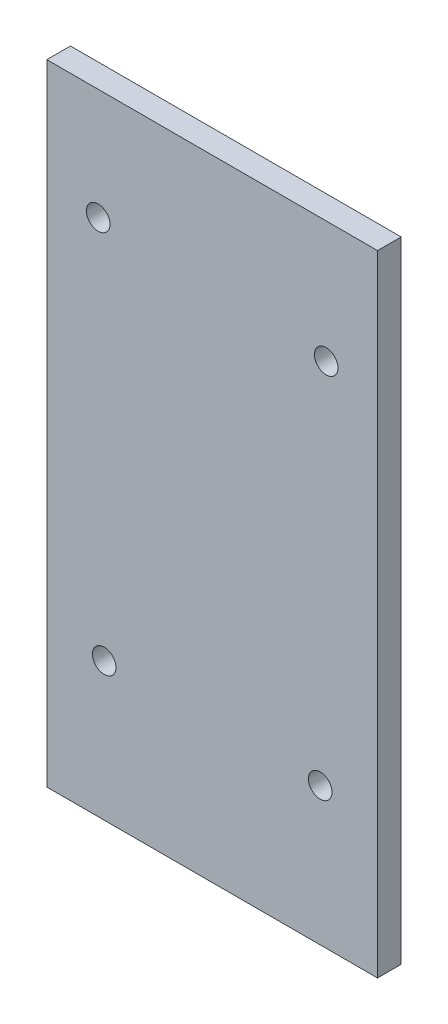
ISO-10303-21;
HEADER;
FILE_DESCRIPTION(('STEP AP214'),'2;1');
FILE_NAME('part.step','',(''),(''),'','','');
FILE_SCHEMA(('AUTOMOTIVE_DESIGN { 1 0 10303 214 1 1 1 1 }'));
ENDSEC;
DATA;
#1=APPLICATION_CONTEXT('core data for automotive mechanical design processes');
#2=APPLICATION_PROTOCOL_DEFINITION('international standard','automotive_design',2000,#1);
#3=PRODUCT_CONTEXT('',#1,'mechanical');
#4=PRODUCT('Part','Part','',(#3));
#5=PRODUCT_RELATED_PRODUCT_CATEGORY('part','',(#4));
#6=PRODUCT_DEFINITION_FORMATION('','',#4);
#7=PRODUCT_DEFINITION_CONTEXT('part definition',#1,'design');
#8=PRODUCT_DEFINITION('design','',#6,#7);
#9=PRODUCT_DEFINITION_SHAPE('','',#8);
#10=(LENGTH_UNIT() NAMED_UNIT(*) SI_UNIT(.MILLI.,.METRE.));
#11=(NAMED_UNIT(*) PLANE_ANGLE_UNIT() SI_UNIT($,.RADIAN.));
#12=(NAMED_UNIT(*) SI_UNIT($,.STERADIAN.) SOLID_ANGLE_UNIT());
#13=UNCERTAINTY_MEASURE_WITH_UNIT(LENGTH_MEASURE(1.E-05),#10,'distance_accuracy_value','');
#14=(GEOMETRIC_REPRESENTATION_CONTEXT(3) GLOBAL_UNCERTAINTY_ASSIGNED_CONTEXT((#13)) GLOBAL_UNIT_ASSIGNED_CONTEXT((#10,
#11,#12)) REPRESENTATION_CONTEXT('',''));
#15=CARTESIAN_POINT('',(0.,0.,0.));
#16=DIRECTION('',(0.,0.,1.));
#17=DIRECTION('',(1.,0.,0.));
#18=AXIS2_PLACEMENT_3D('',#15,#16,#17);
#19=CARTESIAN_POINT('',(-35.,66.67,5.));
#20=DIRECTION('',(1.,0.,0.));
#21=DIRECTION('',(0.,1.,0.));
#22=AXIS2_PLACEMENT_3D('',#19,#20,#21);
#23=PLANE('',#22);
#24=DIRECTION('',(0.,-1.,0.));
#25=VECTOR('',#24,1.);
#26=CARTESIAN_POINT('',(-35.,66.67,0.));
#27=LINE('',#26,#25);
#28=CARTESIAN_POINT('',(-35.,66.67,0.));
#29=VERTEX_POINT('',#28);
#30=CARTESIAN_POINT('',(-35.,-66.67,0.));
#31=VERTEX_POINT('',#30);
#32=EDGE_CURVE('E101',#29,#31,#27,.T.);
#33=ORIENTED_EDGE('',*,*,#32,.T.);
#34=DIRECTION('',(0.,0.,-1.));
#35=VECTOR('',#34,1.);
#36=CARTESIAN_POINT('',(-35.,-66.67,5.));
#37=LINE('',#36,#35);
#38=CARTESIAN_POINT('',(-35.,-66.67,5.));
#39=VERTEX_POINT('',#38);
#40=EDGE_CURVE('E11',#39,#31,#37,.T.);
#41=ORIENTED_EDGE('',*,*,#40,.F.);
#42=DIRECTION('',(0.,-1.,0.));
#43=VECTOR('',#42,1.);
#44=CARTESIAN_POINT('',(-35.,66.67,5.));
#45=LINE('',#44,#43);
#46=CARTESIAN_POINT('',(-35.,66.67,5.));
#47=VERTEX_POINT('',#46);
#48=EDGE_CURVE('E88',#47,#39,#45,.T.);
#49=ORIENTED_EDGE('',*,*,#48,.F.);
#50=DIRECTION('',(0.,0.,-1.));
#51=VECTOR('',#50,1.);
#52=CARTESIAN_POINT('',(-35.,66.67,5.));
#53=LINE('',#52,#51);
#54=EDGE_CURVE('E97',#47,#29,#53,.T.);
#55=ORIENTED_EDGE('',*,*,#54,.T.);
#56=EDGE_LOOP('',(#33,#41,#49,#55));
#57=FACE_BOUND('',#56,.T.);
#58=ADVANCED_FACE('F35',(#57),#23,.F.);
#59=CARTESIAN_POINT('',(35.,-66.67,5.));
#60=DIRECTION('',(0.,1.,0.));
#61=DIRECTION('',(-1.,0.,0.));
#62=AXIS2_PLACEMENT_3D('',#59,#60,#61);
#63=PLANE('',#62);
#64=DIRECTION('',(1.,0.,0.));
#65=VECTOR('',#64,1.);
#66=CARTESIAN_POINT('',(35.,-66.67,0.));
#67=LINE('',#66,#65);
#68=CARTESIAN_POINT('',(35.,-66.67,0.));
#69=VERTEX_POINT('',#68);
#70=EDGE_CURVE('E92',#31,#69,#67,.T.);
#71=ORIENTED_EDGE('',*,*,#70,.T.);
#72=DIRECTION('',(0.,0.,-1.));
#73=VECTOR('',#72,1.);
#74=CARTESIAN_POINT('',(35.,-66.67,5.));
#75=LINE('',#74,#73);
#76=CARTESIAN_POINT('',(35.,-66.67,5.));
#77=VERTEX_POINT('',#76);
#78=EDGE_CURVE('E44',#77,#69,#75,.T.);
#79=ORIENTED_EDGE('',*,*,#78,.F.);
#80=DIRECTION('',(1.,0.,0.));
#81=VECTOR('',#80,1.);
#82=CARTESIAN_POINT('',(35.,-66.67,5.));
#83=LINE('',#82,#81);
#84=EDGE_CURVE('E83',#39,#77,#83,.T.);
#85=ORIENTED_EDGE('',*,*,#84,.F.);
#86=ORIENTED_EDGE('',*,*,#40,.T.);
#87=EDGE_LOOP('',(#71,#79,#85,#86));
#88=FACE_BOUND('',#87,.T.);
#89=ADVANCED_FACE('F91',(#88),#63,.F.);
#90=CARTESIAN_POINT('',(35.,66.67,5.));
#91=DIRECTION('',(-1.,0.,0.));
#92=DIRECTION('',(0.,-1.,0.));
#93=AXIS2_PLACEMENT_3D('',#90,#91,#92);
#94=PLANE('',#93);
#95=DIRECTION('',(0.,1.,0.));
#96=VECTOR('',#95,1.);
#97=CARTESIAN_POINT('',(35.,66.67,0.));
#98=LINE('',#97,#96);
#99=CARTESIAN_POINT('',(35.,66.67,0.));
#100=VERTEX_POINT('',#99);
#101=EDGE_CURVE('E70',#69,#100,#98,.T.);
#102=ORIENTED_EDGE('',*,*,#101,.T.);
#103=DIRECTION('',(0.,0.,-1.));
#104=VECTOR('',#103,1.);
#105=CARTESIAN_POINT('',(35.,66.67,5.));
#106=LINE('',#105,#104);
#107=CARTESIAN_POINT('',(35.,66.67,5.));
#108=VERTEX_POINT('',#107);
#109=EDGE_CURVE('E93',#108,#100,#106,.T.);
#110=ORIENTED_EDGE('',*,*,#109,.F.);
#111=DIRECTION('',(0.,1.,0.));
#112=VECTOR('',#111,1.);
#113=CARTESIAN_POINT('',(35.,66.67,5.));
#114=LINE('',#113,#112);
#115=EDGE_CURVE('E86',#77,#108,#114,.T.);
#116=ORIENTED_EDGE('',*,*,#115,.F.);
#117=ORIENTED_EDGE('',*,*,#78,.T.);
#118=EDGE_LOOP('',(#102,#110,#116,#117));
#119=FACE_BOUND('',#118,.T.);
#120=ADVANCED_FACE('F95',(#119),#94,.F.);
#121=CARTESIAN_POINT('',(35.,66.67,5.));
#122=DIRECTION('',(0.,-1.,0.));
#123=DIRECTION('',(1.,0.,0.));
#124=AXIS2_PLACEMENT_3D('',#121,#122,#123);
#125=PLANE('',#124);
#126=DIRECTION('',(-1.,0.,0.));
#127=VECTOR('',#126,1.);
#128=CARTESIAN_POINT('',(35.,66.67,0.));
#129=LINE('',#128,#127);
#130=EDGE_CURVE('E76',#100,#29,#129,.T.);
#131=ORIENTED_EDGE('',*,*,#130,.T.);
#132=ORIENTED_EDGE('',*,*,#54,.F.);
#133=DIRECTION('',(-1.,0.,0.));
#134=VECTOR('',#133,1.);
#135=CARTESIAN_POINT('',(35.,66.67,5.));
#136=LINE('',#135,#134);
#137=EDGE_CURVE('E53',#108,#47,#136,.T.);
#138=ORIENTED_EDGE('',*,*,#137,.F.);
#139=ORIENTED_EDGE('',*,*,#109,.T.);
#140=EDGE_LOOP('',(#131,#132,#138,#139));
#141=FACE_BOUND('',#140,.T.);
#142=ADVANCED_FACE('F137',(#141),#125,.F.);
#143=CARTESIAN_POINT('',(0.,0.,5.));
#144=DIRECTION('',(0.,0.,-1.));
#145=DIRECTION('',(-1.,0.,0.));
#146=AXIS2_PLACEMENT_3D('',#143,#144,#145);
#147=PLANE('',#146);
#148=CARTESIAN_POINT('',(-22.86,-37.46,5.));
#149=DIRECTION('',(0.,0.,1.));
#150=DIRECTION('',(1.,0.,0.));
#151=AXIS2_PLACEMENT_3D('',#148,#149,#150);
#152=CIRCLE('',#151,2.5);
#153=CARTESIAN_POINT('',(-20.36,-37.46,5.));
#154=VERTEX_POINT('',#153);
#155=EDGE_CURVE('E219',#154,#154,#152,.T.);
#156=ORIENTED_EDGE('',*,*,#155,.F.);
#157=EDGE_LOOP('',(#156));
#158=FACE_BOUND('',#157,.T.);
#159=CARTESIAN_POINT('',(22.86,-37.46,5.));
#160=DIRECTION('',(0.,0.,1.));
#161=DIRECTION('',(1.,0.,0.));
#162=AXIS2_PLACEMENT_3D('',#159,#160,#161);
#163=CIRCLE('',#162,2.5);
#164=CARTESIAN_POINT('',(25.36,-37.46,5.));
#165=VERTEX_POINT('',#164);
#166=EDGE_CURVE('E216',#165,#165,#163,.T.);
#167=ORIENTED_EDGE('',*,*,#166,.F.);
#168=EDGE_LOOP('',(#167));
#169=FACE_BOUND('',#168,.T.);
#170=CARTESIAN_POINT('',(24.13,40.95,5.));
#171=DIRECTION('',(0.,0.,1.));
#172=DIRECTION('',(1.,0.,0.));
#173=AXIS2_PLACEMENT_3D('',#170,#171,#172);
#174=CIRCLE('',#173,2.5);
#175=CARTESIAN_POINT('',(26.63,40.95,5.));
#176=VERTEX_POINT('',#175);
#177=EDGE_CURVE('E218',#176,#176,#174,.T.);
#178=ORIENTED_EDGE('',*,*,#177,.F.);
#179=EDGE_LOOP('',(#178));
#180=FACE_BOUND('',#179,.T.);
#181=CARTESIAN_POINT('',(-24.13,43.15,5.));
#182=DIRECTION('',(0.,0.,1.));
#183=DIRECTION('',(1.,0.,0.));
#184=AXIS2_PLACEMENT_3D('',#181,#182,#183);
#185=CIRCLE('',#184,2.5);
#186=CARTESIAN_POINT('',(-21.63,43.15,5.));
#187=VERTEX_POINT('',#186);
#188=EDGE_CURVE('E113',#187,#187,#185,.T.);
#189=ORIENTED_EDGE('',*,*,#188,.F.);
#190=EDGE_LOOP('',(#189));
#191=FACE_BOUND('',#190,.T.);
#192=ORIENTED_EDGE('',*,*,#48,.T.);
#193=ORIENTED_EDGE('',*,*,#84,.T.);
#194=ORIENTED_EDGE('',*,*,#115,.T.);
#195=ORIENTED_EDGE('',*,*,#137,.T.);
#196=EDGE_LOOP('',(#192,#193,#194,#195));
#197=FACE_BOUND('',#196,.T.);
#198=ADVANCED_FACE('F84',(#158,#169,#180,#191,#197),#147,.F.);
#199=CARTESIAN_POINT('',(0.,0.,0.));
#200=DIRECTION('',(0.,0.,-1.));
#201=DIRECTION('',(-1.,0.,0.));
#202=AXIS2_PLACEMENT_3D('',#199,#200,#201);
#203=PLANE('',#202);
#204=CARTESIAN_POINT('',(-22.86,-37.46,0.));
#205=DIRECTION('',(0.,0.,-1.));
#206=DIRECTION('',(-1.,0.,0.));
#207=AXIS2_PLACEMENT_3D('',#204,#205,#206);
#208=CIRCLE('',#207,2.5);
#209=CARTESIAN_POINT('',(-25.36,-37.46,0.));
#210=VERTEX_POINT('',#209);
#211=EDGE_CURVE('E38',#210,#210,#208,.T.);
#212=ORIENTED_EDGE('',*,*,#211,.F.);
#213=EDGE_LOOP('',(#212));
#214=FACE_BOUND('',#213,.T.);
#215=CARTESIAN_POINT('',(22.86,-37.46,0.));
#216=DIRECTION('',(0.,0.,-1.));
#217=DIRECTION('',(-1.,0.,0.));
#218=AXIS2_PLACEMENT_3D('',#215,#216,#217);
#219=CIRCLE('',#218,2.5);
#220=CARTESIAN_POINT('',(20.36,-37.46,0.));
#221=VERTEX_POINT('',#220);
#222=EDGE_CURVE('E115',#221,#221,#219,.T.);
#223=ORIENTED_EDGE('',*,*,#222,.F.);
#224=EDGE_LOOP('',(#223));
#225=FACE_BOUND('',#224,.T.);
#226=CARTESIAN_POINT('',(24.13,40.95,0.));
#227=DIRECTION('',(0.,0.,-1.));
#228=DIRECTION('',(-1.,0.,0.));
#229=AXIS2_PLACEMENT_3D('',#226,#227,#228);
#230=CIRCLE('',#229,2.5);
#231=CARTESIAN_POINT('',(21.63,40.95,0.));
#232=VERTEX_POINT('',#231);
#233=EDGE_CURVE('E112',#232,#232,#230,.T.);
#234=ORIENTED_EDGE('',*,*,#233,.F.);
#235=EDGE_LOOP('',(#234));
#236=FACE_BOUND('',#235,.T.);
#237=CARTESIAN_POINT('',(-24.13,43.15,0.));
#238=DIRECTION('',(0.,0.,-1.));
#239=DIRECTION('',(-1.,0.,0.));
#240=AXIS2_PLACEMENT_3D('',#237,#238,#239);
#241=CIRCLE('',#240,2.5);
#242=CARTESIAN_POINT('',(-26.63,43.15,0.));
#243=VERTEX_POINT('',#242);
#244=EDGE_CURVE('E109',#243,#243,#241,.T.);
#245=ORIENTED_EDGE('',*,*,#244,.F.);
#246=EDGE_LOOP('',(#245));
#247=FACE_BOUND('',#246,.T.);
#248=ORIENTED_EDGE('',*,*,#32,.F.);
#249=ORIENTED_EDGE('',*,*,#130,.F.);
#250=ORIENTED_EDGE('',*,*,#101,.F.);
#251=ORIENTED_EDGE('',*,*,#70,.F.);
#252=EDGE_LOOP('',(#248,#249,#250,#251));
#253=FACE_BOUND('',#252,.T.);
#254=ADVANCED_FACE('F125',(#214,#225,#236,#247,#253),#203,.T.);
#255=CARTESIAN_POINT('',(-24.13,43.15,-15.));
#256=DIRECTION('',(0.,0.,1.));
#257=DIRECTION('',(1.,0.,0.));
#258=AXIS2_PLACEMENT_3D('',#255,#256,#257);
#259=CYLINDRICAL_SURFACE('',#258,2.5);
#260=ORIENTED_EDGE('',*,*,#244,.T.);
#261=EDGE_LOOP('',(#260));
#262=FACE_BOUND('',#261,.T.);
#263=ORIENTED_EDGE('',*,*,#188,.T.);
#264=EDGE_LOOP('',(#263));
#265=FACE_BOUND('',#264,.T.);
#266=ADVANCED_FACE('F128',(#262,#265),#259,.F.);
#267=CARTESIAN_POINT('',(24.13,40.95,-15.));
#268=DIRECTION('',(0.,0.,1.));
#269=DIRECTION('',(1.,0.,0.));
#270=AXIS2_PLACEMENT_3D('',#267,#268,#269);
#271=CYLINDRICAL_SURFACE('',#270,2.5);
#272=ORIENTED_EDGE('',*,*,#233,.T.);
#273=EDGE_LOOP('',(#272));
#274=FACE_BOUND('',#273,.T.);
#275=ORIENTED_EDGE('',*,*,#177,.T.);
#276=EDGE_LOOP('',(#275));
#277=FACE_BOUND('',#276,.T.);
#278=ADVANCED_FACE('F182',(#274,#277),#271,.F.);
#279=CARTESIAN_POINT('',(22.86,-37.46,-15.));
#280=DIRECTION('',(0.,0.,1.));
#281=DIRECTION('',(1.,0.,0.));
#282=AXIS2_PLACEMENT_3D('',#279,#280,#281);
#283=CYLINDRICAL_SURFACE('',#282,2.5);
#284=ORIENTED_EDGE('',*,*,#222,.T.);
#285=EDGE_LOOP('',(#284));
#286=FACE_BOUND('',#285,.T.);
#287=ORIENTED_EDGE('',*,*,#166,.T.);
#288=EDGE_LOOP('',(#287));
#289=FACE_BOUND('',#288,.T.);
#290=ADVANCED_FACE('F192',(#286,#289),#283,.F.);
#291=CARTESIAN_POINT('',(-22.86,-37.46,-15.));
#292=DIRECTION('',(0.,0.,1.));
#293=DIRECTION('',(1.,0.,0.));
#294=AXIS2_PLACEMENT_3D('',#291,#292,#293);
#295=CYLINDRICAL_SURFACE('',#294,2.5);
#296=ORIENTED_EDGE('',*,*,#211,.T.);
#297=EDGE_LOOP('',(#296));
#298=FACE_BOUND('',#297,.T.);
#299=ORIENTED_EDGE('',*,*,#155,.T.);
#300=EDGE_LOOP('',(#299));
#301=FACE_BOUND('',#300,.T.);
#302=ADVANCED_FACE('F122',(#298,#301),#295,.F.);
#303=CLOSED_SHELL('',(#58,#89,#120,#142,#198,#254,#266,#278,#290,#302));
#304=MANIFOLD_SOLID_BREP('B2',#303);
#305=ADVANCED_BREP_SHAPE_REPRESENTATION('',(#18,#304),#14);
#306=SHAPE_DEFINITION_REPRESENTATION(#9,#305);
ENDSEC;
END-ISO-10303-21;
